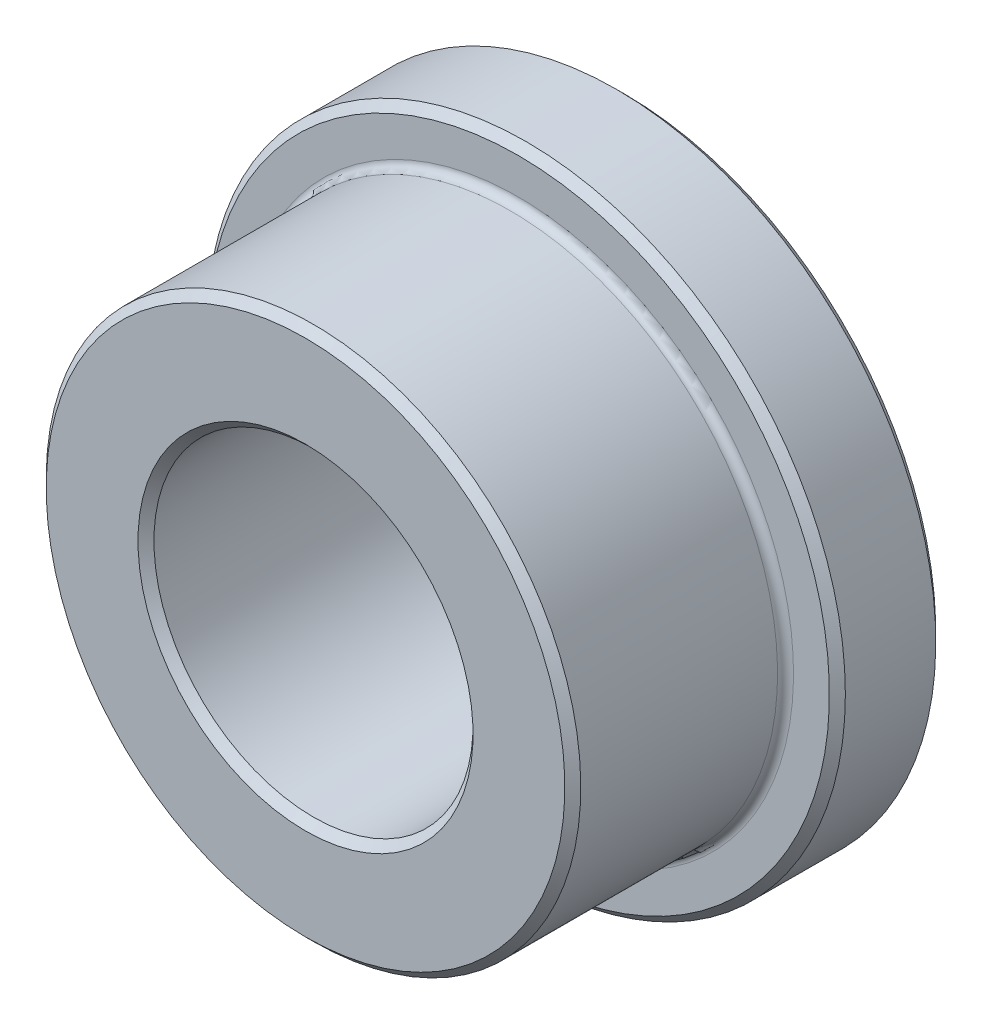
ISO-10303-21;
HEADER;
FILE_DESCRIPTION(('STEP AP214'),'2;1');
FILE_NAME('part.step','',(''),(''),'','','');
FILE_SCHEMA(('AUTOMOTIVE_DESIGN { 1 0 10303 214 1 1 1 1 }'));
ENDSEC;
DATA;
#1=APPLICATION_CONTEXT('core data for automotive mechanical design processes');
#2=APPLICATION_PROTOCOL_DEFINITION('international standard','automotive_design',2000,#1);
#3=PRODUCT_CONTEXT('',#1,'mechanical');
#4=PRODUCT('Part','Part','',(#3));
#5=PRODUCT_RELATED_PRODUCT_CATEGORY('part','',(#4));
#6=PRODUCT_DEFINITION_FORMATION('','',#4);
#7=PRODUCT_DEFINITION_CONTEXT('part definition',#1,'design');
#8=PRODUCT_DEFINITION('design','',#6,#7);
#9=PRODUCT_DEFINITION_SHAPE('','',#8);
#10=(LENGTH_UNIT() NAMED_UNIT(*) SI_UNIT(.MILLI.,.METRE.));
#11=(NAMED_UNIT(*) PLANE_ANGLE_UNIT() SI_UNIT($,.RADIAN.));
#12=(NAMED_UNIT(*) SI_UNIT($,.STERADIAN.) SOLID_ANGLE_UNIT());
#13=UNCERTAINTY_MEASURE_WITH_UNIT(LENGTH_MEASURE(1.E-05),#10,'distance_accuracy_value','');
#14=(GEOMETRIC_REPRESENTATION_CONTEXT(3) GLOBAL_UNCERTAINTY_ASSIGNED_CONTEXT((#13)) GLOBAL_UNIT_ASSIGNED_CONTEXT((#10,
#11,#12)) REPRESENTATION_CONTEXT('',''));
#15=CARTESIAN_POINT('',(0.,0.,0.));
#16=DIRECTION('',(0.,0.,1.));
#17=DIRECTION('',(1.,0.,0.));
#18=AXIS2_PLACEMENT_3D('',#15,#16,#17);
#19=CARTESIAN_POINT('',(0.,6.,-3.));
#20=DIRECTION('',(0.,0.,-1.));
#21=DIRECTION('',(0.,1.,0.));
#22=AXIS2_PLACEMENT_3D('',#19,#20,#21);
#23=PLANE('',#22);
#24=CARTESIAN_POINT('',(0.,0.,-3.));
#25=DIRECTION('',(0.,0.,-1.));
#26=DIRECTION('',(0.,1.,0.));
#27=AXIS2_PLACEMENT_3D('',#24,#25,#26);
#28=CIRCLE('',#27,5.85);
#29=CARTESIAN_POINT('',(0.,5.85,-3.));
#30=VERTEX_POINT('',#29);
#31=EDGE_CURVE('E83',#30,#30,#28,.T.);
#32=ORIENTED_EDGE('',*,*,#31,.T.);
#33=EDGE_LOOP('',(#32));
#34=FACE_BOUND('',#33,.T.);
#35=CARTESIAN_POINT('',(0.,0.,-3.));
#36=DIRECTION('',(0.,0.,-1.));
#37=DIRECTION('',(0.,1.,0.));
#38=AXIS2_PLACEMENT_3D('',#35,#36,#37);
#39=CIRCLE('',#38,3.);
#40=CARTESIAN_POINT('',(0.,3.,-3.));
#41=VERTEX_POINT('',#40);
#42=EDGE_CURVE('E86',#41,#41,#39,.T.);
#43=ORIENTED_EDGE('',*,*,#42,.F.);
#44=EDGE_LOOP('',(#43));
#45=FACE_BOUND('',#44,.T.);
#46=ADVANCED_FACE('F39',(#34,#45),#23,.T.);
#47=CARTESIAN_POINT('',(0.,0.,-3.));
#48=DIRECTION('',(0.,0.,-1.));
#49=DIRECTION('',(0.,1.,0.));
#50=AXIS2_PLACEMENT_3D('',#47,#48,#49);
#51=CYLINDRICAL_SURFACE('',#50,6.);
#52=CARTESIAN_POINT('',(0.,0.,-2.85));
#53=DIRECTION('',(0.,0.,-1.));
#54=DIRECTION('',(0.,1.,0.));
#55=AXIS2_PLACEMENT_3D('',#52,#53,#54);
#56=CIRCLE('',#55,6.);
#57=CARTESIAN_POINT('',(0.,6.,-2.85));
#58=VERTEX_POINT('',#57);
#59=EDGE_CURVE('E80',#58,#58,#56,.F.);
#60=ORIENTED_EDGE('',*,*,#59,.T.);
#61=EDGE_LOOP('',(#60));
#62=FACE_BOUND('',#61,.T.);
#63=CARTESIAN_POINT('',(0.,0.,-1.15));
#64=DIRECTION('',(0.,0.,1.));
#65=DIRECTION('',(0.,-1.,0.));
#66=AXIS2_PLACEMENT_3D('',#63,#64,#65);
#67=CIRCLE('',#66,6.);
#68=CARTESIAN_POINT('',(0.,-6.,-1.15));
#69=VERTEX_POINT('',#68);
#70=EDGE_CURVE('E82',#69,#69,#67,.F.);
#71=ORIENTED_EDGE('',*,*,#70,.T.);
#72=EDGE_LOOP('',(#71));
#73=FACE_BOUND('',#72,.T.);
#74=ADVANCED_FACE('F96',(#62,#73),#51,.T.);
#75=CARTESIAN_POINT('',(0.,6.,-0.999999999999999));
#76=DIRECTION('',(0.,0.,1.));
#77=DIRECTION('',(0.,-1.,0.));
#78=AXIS2_PLACEMENT_3D('',#75,#76,#77);
#79=PLANE('',#78);
#80=CARTESIAN_POINT('',(0.,0.,-0.999999999999999));
#81=DIRECTION('',(0.,0.,1.));
#82=DIRECTION('',(0.,-1.,0.));
#83=AXIS2_PLACEMENT_3D('',#80,#81,#82);
#84=CIRCLE('',#83,5.1755);
#85=CARTESIAN_POINT('',(0.,-5.1755,-1.));
#86=VERTEX_POINT('',#85);
#87=EDGE_CURVE('E50',#86,#86,#84,.F.);
#88=ORIENTED_EDGE('',*,*,#87,.T.);
#89=EDGE_LOOP('',(#88));
#90=FACE_BOUND('',#89,.T.);
#91=CARTESIAN_POINT('',(0.,0.,-0.999999999999999));
#92=DIRECTION('',(0.,0.,1.));
#93=DIRECTION('',(0.,-1.,0.));
#94=AXIS2_PLACEMENT_3D('',#91,#92,#93);
#95=CIRCLE('',#94,5.85);
#96=CARTESIAN_POINT('',(0.,-5.85,-1.));
#97=VERTEX_POINT('',#96);
#98=EDGE_CURVE('E74',#97,#97,#95,.T.);
#99=ORIENTED_EDGE('',*,*,#98,.T.);
#100=EDGE_LOOP('',(#99));
#101=FACE_BOUND('',#100,.T.);
#102=ADVANCED_FACE('F104',(#90,#101),#79,.T.);
#103=CARTESIAN_POINT('',(0.,0.,-3.));
#104=DIRECTION('',(0.,0.,-1.));
#105=DIRECTION('',(0.,1.,0.));
#106=AXIS2_PLACEMENT_3D('',#103,#104,#105);
#107=CYLINDRICAL_SURFACE('',#106,5.0255);
#108=CARTESIAN_POINT('',(0.,0.,-0.85));
#109=DIRECTION('',(0.,0.,1.));
#110=DIRECTION('',(0.,-1.,0.));
#111=AXIS2_PLACEMENT_3D('',#108,#109,#110);
#112=CIRCLE('',#111,5.0255);
#113=CARTESIAN_POINT('',(0.,-5.0255,-0.85));
#114=VERTEX_POINT('',#113);
#115=EDGE_CURVE('E10',#114,#114,#112,.T.);
#116=ORIENTED_EDGE('',*,*,#115,.T.);
#117=EDGE_LOOP('',(#116));
#118=FACE_BOUND('',#117,.T.);
#119=CARTESIAN_POINT('',(0.,0.,2.85));
#120=DIRECTION('',(0.,0.,1.));
#121=DIRECTION('',(0.,-1.,0.));
#122=AXIS2_PLACEMENT_3D('',#119,#120,#121);
#123=CIRCLE('',#122,5.0255);
#124=CARTESIAN_POINT('',(0.,-5.0255,2.85));
#125=VERTEX_POINT('',#124);
#126=EDGE_CURVE('E66',#125,#125,#123,.F.);
#127=ORIENTED_EDGE('',*,*,#126,.T.);
#128=EDGE_LOOP('',(#127));
#129=FACE_BOUND('',#128,.T.);
#130=ADVANCED_FACE('F135',(#118,#129),#107,.T.);
#131=CARTESIAN_POINT('',(0.,5.0255,3.));
#132=DIRECTION('',(0.,0.,1.));
#133=DIRECTION('',(0.,-1.,0.));
#134=AXIS2_PLACEMENT_3D('',#131,#132,#133);
#135=PLANE('',#134);
#136=CARTESIAN_POINT('',(0.,0.,3.));
#137=DIRECTION('',(0.,0.,1.));
#138=DIRECTION('',(0.,-1.,0.));
#139=AXIS2_PLACEMENT_3D('',#136,#137,#138);
#140=CIRCLE('',#139,4.8755);
#141=CARTESIAN_POINT('',(0.,-4.8755,3.));
#142=VERTEX_POINT('',#141);
#143=EDGE_CURVE('E56',#142,#142,#140,.T.);
#144=ORIENTED_EDGE('',*,*,#143,.T.);
#145=EDGE_LOOP('',(#144));
#146=FACE_BOUND('',#145,.T.);
#147=CARTESIAN_POINT('',(0.,0.,3.));
#148=DIRECTION('',(0.,0.,1.));
#149=DIRECTION('',(0.,-1.,0.));
#150=AXIS2_PLACEMENT_3D('',#147,#148,#149);
#151=CIRCLE('',#150,3.15);
#152=CARTESIAN_POINT('',(0.,-3.15,3.));
#153=VERTEX_POINT('',#152);
#154=EDGE_CURVE('E63',#153,#153,#151,.F.);
#155=ORIENTED_EDGE('',*,*,#154,.T.);
#156=EDGE_LOOP('',(#155));
#157=FACE_BOUND('',#156,.T.);
#158=ADVANCED_FACE('F132',(#146,#157),#135,.T.);
#159=CARTESIAN_POINT('',(0.,0.,-3.));
#160=DIRECTION('',(0.,0.,-1.));
#161=DIRECTION('',(0.,1.,0.));
#162=AXIS2_PLACEMENT_3D('',#159,#160,#161);
#163=CYLINDRICAL_SURFACE('',#162,3.);
#164=CARTESIAN_POINT('',(0.,0.,2.85));
#165=DIRECTION('',(0.,0.,1.));
#166=DIRECTION('',(0.,-1.,0.));
#167=AXIS2_PLACEMENT_3D('',#164,#165,#166);
#168=CIRCLE('',#167,3.);
#169=CARTESIAN_POINT('',(0.,-3.,2.85));
#170=VERTEX_POINT('',#169);
#171=EDGE_CURVE('E52',#170,#170,#168,.T.);
#172=ORIENTED_EDGE('',*,*,#171,.T.);
#173=EDGE_LOOP('',(#172));
#174=FACE_BOUND('',#173,.T.);
#175=ORIENTED_EDGE('',*,*,#42,.T.);
#176=EDGE_LOOP('',(#175));
#177=FACE_BOUND('',#176,.T.);
#178=ADVANCED_FACE('F91',(#174,#177),#163,.F.);
#179=CARTESIAN_POINT('',(0.,0.,-3.));
#180=DIRECTION('',(0.,0.,1.));
#181=DIRECTION('',(0.,-1.,0.));
#182=AXIS2_PLACEMENT_3D('',#179,#180,#181);
#183=CONICAL_SURFACE('',#182,5.85,0.785398163397445);
#184=ORIENTED_EDGE('',*,*,#59,.F.);
#185=EDGE_LOOP('',(#184));
#186=FACE_BOUND('',#185,.T.);
#187=ORIENTED_EDGE('',*,*,#31,.F.);
#188=EDGE_LOOP('',(#187));
#189=FACE_BOUND('',#188,.T.);
#190=ADVANCED_FACE('F107',(#186,#189),#183,.T.);
#191=CARTESIAN_POINT('',(0.,0.,-1.15));
#192=DIRECTION('',(0.,0.,-1.));
#193=DIRECTION('',(0.,1.,0.));
#194=AXIS2_PLACEMENT_3D('',#191,#192,#193);
#195=CONICAL_SURFACE('',#194,6.,0.785398163397455);
#196=ORIENTED_EDGE('',*,*,#98,.F.);
#197=EDGE_LOOP('',(#196));
#198=FACE_BOUND('',#197,.T.);
#199=ORIENTED_EDGE('',*,*,#70,.F.);
#200=EDGE_LOOP('',(#199));
#201=FACE_BOUND('',#200,.T.);
#202=ADVANCED_FACE('F115',(#198,#201),#195,.T.);
#203=CARTESIAN_POINT('',(0.,0.,2.85));
#204=DIRECTION('',(0.,0.,-1.));
#205=DIRECTION('',(0.,1.,0.));
#206=AXIS2_PLACEMENT_3D('',#203,#204,#205);
#207=CONICAL_SURFACE('',#206,5.0255,0.785398163397451);
#208=ORIENTED_EDGE('',*,*,#143,.F.);
#209=EDGE_LOOP('',(#208));
#210=FACE_BOUND('',#209,.T.);
#211=ORIENTED_EDGE('',*,*,#126,.F.);
#212=EDGE_LOOP('',(#211));
#213=FACE_BOUND('',#212,.T.);
#214=ADVANCED_FACE('F116',(#210,#213),#207,.T.);
#215=CARTESIAN_POINT('',(0.,0.,3.));
#216=DIRECTION('',(0.,0.,1.));
#217=DIRECTION('',(0.,-1.,0.));
#218=AXIS2_PLACEMENT_3D('',#215,#216,#217);
#219=CONICAL_SURFACE('',#218,3.15,0.78539816339745);
#220=ORIENTED_EDGE('',*,*,#171,.F.);
#221=EDGE_LOOP('',(#220));
#222=FACE_BOUND('',#221,.T.);
#223=ORIENTED_EDGE('',*,*,#154,.F.);
#224=EDGE_LOOP('',(#223));
#225=FACE_BOUND('',#224,.T.);
#226=ADVANCED_FACE('F118',(#222,#225),#219,.F.);
#227=CARTESIAN_POINT('',(0.,0.,-0.85));
#228=DIRECTION('',(0.,0.,1.));
#229=DIRECTION('',(0.,-1.,0.));
#230=AXIS2_PLACEMENT_3D('',#227,#228,#229);
#231=TOROIDAL_SURFACE('',#230,5.1755,0.15);
#232=ORIENTED_EDGE('',*,*,#115,.F.);
#233=EDGE_LOOP('',(#232));
#234=FACE_BOUND('',#233,.T.);
#235=ORIENTED_EDGE('',*,*,#87,.F.);
#236=EDGE_LOOP('',(#235));
#237=FACE_BOUND('',#236,.T.);
#238=ADVANCED_FACE('F41',(#234,#237),#231,.F.);
#239=CLOSED_SHELL('',(#46,#74,#102,#130,#158,#178,#190,#202,#214,#226,#238));
#240=MANIFOLD_SOLID_BREP('B2',#239);
#241=ADVANCED_BREP_SHAPE_REPRESENTATION('',(#18,#240),#14);
#242=SHAPE_DEFINITION_REPRESENTATION(#9,#241);
ENDSEC;
END-ISO-10303-21;
